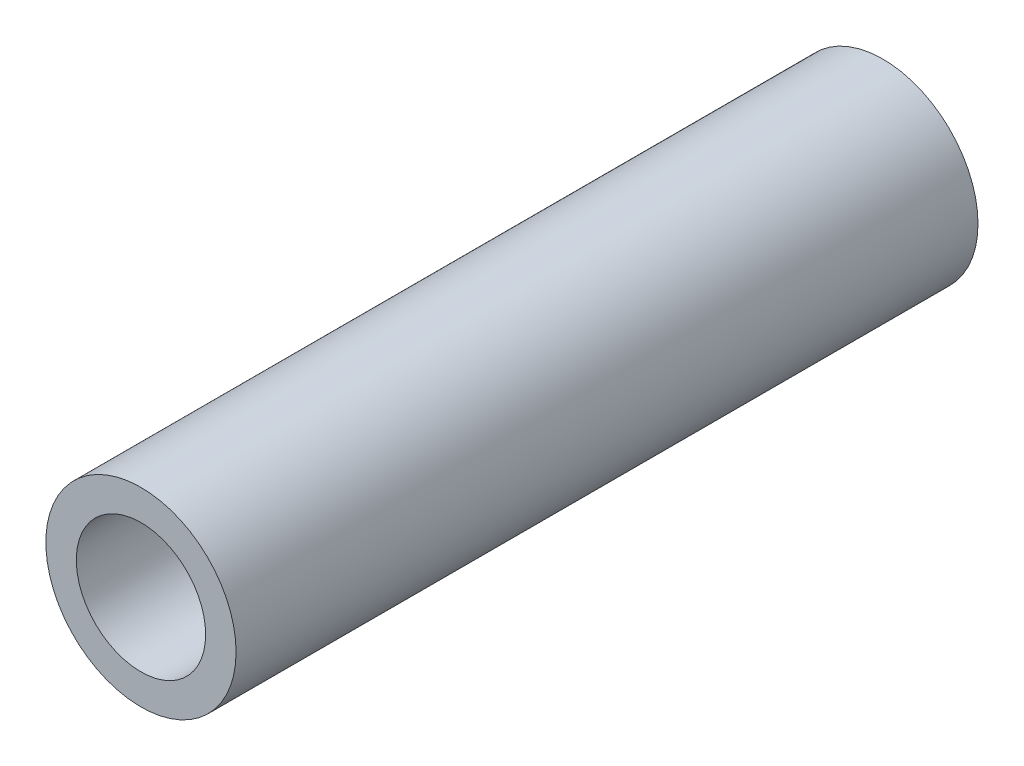
ISO-10303-21;
HEADER;
FILE_DESCRIPTION(('STEP AP214'),'2;1');
FILE_NAME('part.step','',(''),(''),'','','');
FILE_SCHEMA(('AUTOMOTIVE_DESIGN { 1 0 10303 214 1 1 1 1 }'));
ENDSEC;
DATA;
#1=APPLICATION_CONTEXT('core data for automotive mechanical design processes');
#2=APPLICATION_PROTOCOL_DEFINITION('international standard','automotive_design',2000,#1);
#3=PRODUCT_CONTEXT('',#1,'mechanical');
#4=PRODUCT('Part','Part','',(#3));
#5=PRODUCT_RELATED_PRODUCT_CATEGORY('part','',(#4));
#6=PRODUCT_DEFINITION_FORMATION('','',#4);
#7=PRODUCT_DEFINITION_CONTEXT('part definition',#1,'design');
#8=PRODUCT_DEFINITION('design','',#6,#7);
#9=PRODUCT_DEFINITION_SHAPE('','',#8);
#10=(LENGTH_UNIT() NAMED_UNIT(*) SI_UNIT(.MILLI.,.METRE.));
#11=(NAMED_UNIT(*) PLANE_ANGLE_UNIT() SI_UNIT($,.RADIAN.));
#12=(NAMED_UNIT(*) SI_UNIT($,.STERADIAN.) SOLID_ANGLE_UNIT());
#13=UNCERTAINTY_MEASURE_WITH_UNIT(LENGTH_MEASURE(1.E-05),#10,'distance_accuracy_value','');
#14=(GEOMETRIC_REPRESENTATION_CONTEXT(3) GLOBAL_UNCERTAINTY_ASSIGNED_CONTEXT((#13)) GLOBAL_UNIT_ASSIGNED_CONTEXT((#10,
#11,#12)) REPRESENTATION_CONTEXT('',''));
#15=CARTESIAN_POINT('',(0.,0.,0.));
#16=DIRECTION('',(0.,0.,1.));
#17=DIRECTION('',(1.,0.,0.));
#18=AXIS2_PLACEMENT_3D('',#15,#16,#17);
#19=CARTESIAN_POINT('',(0.,0.,58.5));
#20=DIRECTION('',(0.,0.,1.));
#21=DIRECTION('',(1.,0.,0.));
#22=AXIS2_PLACEMENT_3D('',#19,#20,#21);
#23=PLANE('',#22);
#24=CARTESIAN_POINT('',(0.,0.,58.5));
#25=DIRECTION('',(0.,0.,1.));
#26=DIRECTION('',(1.,0.,0.));
#27=AXIS2_PLACEMENT_3D('',#24,#25,#26);
#28=CIRCLE('',#27,7.5);
#29=CARTESIAN_POINT('',(7.5,0.,58.5));
#30=VERTEX_POINT('',#29);
#31=EDGE_CURVE('E10',#30,#30,#28,.T.);
#32=ORIENTED_EDGE('',*,*,#31,.T.);
#33=EDGE_LOOP('',(#32));
#34=FACE_BOUND('',#33,.T.);
#35=CARTESIAN_POINT('',(0.,0.,58.5));
#36=DIRECTION('',(0.,0.,1.));
#37=DIRECTION('',(1.,0.,0.));
#38=AXIS2_PLACEMENT_3D('',#35,#36,#37);
#39=CIRCLE('',#38,5.1);
#40=CARTESIAN_POINT('',(5.1,0.,58.5));
#41=VERTEX_POINT('',#40);
#42=EDGE_CURVE('E44',#41,#41,#39,.T.);
#43=ORIENTED_EDGE('',*,*,#42,.F.);
#44=EDGE_LOOP('',(#43));
#45=FACE_BOUND('',#44,.T.);
#46=ADVANCED_FACE('F33',(#34,#45),#23,.T.);
#47=CARTESIAN_POINT('',(0.,0.,0.));
#48=DIRECTION('',(0.,0.,1.));
#49=DIRECTION('',(1.,0.,0.));
#50=AXIS2_PLACEMENT_3D('',#47,#48,#49);
#51=PLANE('',#50);
#52=CARTESIAN_POINT('',(0.,0.,0.));
#53=DIRECTION('',(0.,0.,1.));
#54=DIRECTION('',(1.,0.,0.));
#55=AXIS2_PLACEMENT_3D('',#52,#53,#54);
#56=CIRCLE('',#55,7.5);
#57=CARTESIAN_POINT('',(7.5,0.,0.));
#58=VERTEX_POINT('',#57);
#59=EDGE_CURVE('E37',#58,#58,#56,.T.);
#60=ORIENTED_EDGE('',*,*,#59,.F.);
#61=EDGE_LOOP('',(#60));
#62=FACE_BOUND('',#61,.T.);
#63=CARTESIAN_POINT('',(0.,0.,0.));
#64=DIRECTION('',(0.,0.,1.));
#65=DIRECTION('',(1.,0.,0.));
#66=AXIS2_PLACEMENT_3D('',#63,#64,#65);
#67=CIRCLE('',#66,5.1);
#68=CARTESIAN_POINT('',(5.1,0.,0.));
#69=VERTEX_POINT('',#68);
#70=EDGE_CURVE('E46',#69,#69,#67,.T.);
#71=ORIENTED_EDGE('',*,*,#70,.T.);
#72=EDGE_LOOP('',(#71));
#73=FACE_BOUND('',#72,.T.);
#74=ADVANCED_FACE('F56',(#62,#73),#51,.F.);
#75=CARTESIAN_POINT('',(0.,0.,58.5));
#76=DIRECTION('',(0.,0.,-1.));
#77=DIRECTION('',(-1.,0.,0.));
#78=AXIS2_PLACEMENT_3D('',#75,#76,#77);
#79=CYLINDRICAL_SURFACE('',#78,7.5);
#80=ORIENTED_EDGE('',*,*,#31,.F.);
#81=EDGE_LOOP('',(#80));
#82=FACE_BOUND('',#81,.T.);
#83=ORIENTED_EDGE('',*,*,#59,.T.);
#84=EDGE_LOOP('',(#83));
#85=FACE_BOUND('',#84,.T.);
#86=ADVANCED_FACE('F35',(#82,#85),#79,.T.);
#87=CARTESIAN_POINT('',(0.,0.,58.5));
#88=DIRECTION('',(0.,0.,-1.));
#89=DIRECTION('',(-1.,0.,0.));
#90=AXIS2_PLACEMENT_3D('',#87,#88,#89);
#91=CYLINDRICAL_SURFACE('',#90,5.1);
#92=ORIENTED_EDGE('',*,*,#42,.T.);
#93=EDGE_LOOP('',(#92));
#94=FACE_BOUND('',#93,.T.);
#95=ORIENTED_EDGE('',*,*,#70,.F.);
#96=EDGE_LOOP('',(#95));
#97=FACE_BOUND('',#96,.T.);
#98=ADVANCED_FACE('F52',(#94,#97),#91,.F.);
#99=CLOSED_SHELL('',(#46,#74,#86,#98));
#100=MANIFOLD_SOLID_BREP('B2',#99);
#101=ADVANCED_BREP_SHAPE_REPRESENTATION('',(#18,#100),#14);
#102=SHAPE_DEFINITION_REPRESENTATION(#9,#101);
ENDSEC;
END-ISO-10303-21;
